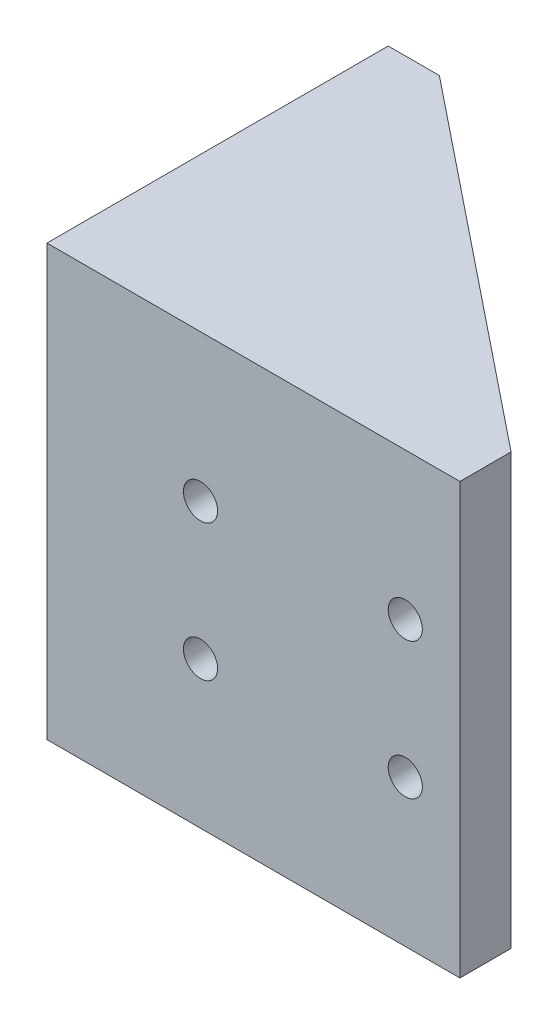
ISO-10303-21;
HEADER;
FILE_DESCRIPTION(('STEP AP214'),'2;1');
FILE_NAME('part.step','',(''),(''),'','','');
FILE_SCHEMA(('AUTOMOTIVE_DESIGN { 1 0 10303 214 1 1 1 1 }'));
ENDSEC;
DATA;
#1=APPLICATION_CONTEXT('core data for automotive mechanical design processes');
#2=APPLICATION_PROTOCOL_DEFINITION('international standard','automotive_design',2000,#1);
#3=PRODUCT_CONTEXT('',#1,'mechanical');
#4=PRODUCT('Part','Part','',(#3));
#5=PRODUCT_RELATED_PRODUCT_CATEGORY('part','',(#4));
#6=PRODUCT_DEFINITION_FORMATION('','',#4);
#7=PRODUCT_DEFINITION_CONTEXT('part definition',#1,'design');
#8=PRODUCT_DEFINITION('design','',#6,#7);
#9=PRODUCT_DEFINITION_SHAPE('','',#8);
#10=(LENGTH_UNIT() NAMED_UNIT(*) SI_UNIT(.MILLI.,.METRE.));
#11=(NAMED_UNIT(*) PLANE_ANGLE_UNIT() SI_UNIT($,.RADIAN.));
#12=(NAMED_UNIT(*) SI_UNIT($,.STERADIAN.) SOLID_ANGLE_UNIT());
#13=UNCERTAINTY_MEASURE_WITH_UNIT(LENGTH_MEASURE(1.E-05),#10,'distance_accuracy_value','');
#14=(GEOMETRIC_REPRESENTATION_CONTEXT(3) GLOBAL_UNCERTAINTY_ASSIGNED_CONTEXT((#13)) GLOBAL_UNIT_ASSIGNED_CONTEXT((#10,
#11,#12)) REPRESENTATION_CONTEXT('',''));
#15=CARTESIAN_POINT('',(0.,0.,0.));
#16=DIRECTION('',(0.,0.,1.));
#17=DIRECTION('',(1.,0.,0.));
#18=AXIS2_PLACEMENT_3D('',#15,#16,#17);
#19=CARTESIAN_POINT('',(24.2,12.6,-3.));
#20=DIRECTION('',(-0.625592184650773,0.,0.780150253799788));
#21=DIRECTION('',(0.780150253799788,0.,0.625592184650773));
#22=AXIS2_PLACEMENT_3D('',#19,#20,#21);
#23=PLANE('',#22);
#24=DIRECTION('',(0.780150253799788,0.,0.625592184650773));
#25=VECTOR('',#24,1.);
#26=CARTESIAN_POINT('',(24.2,-10.1,-3.));
#27=LINE('',#26,#25);
#28=CARTESIAN_POINT('',(3.,-10.1,-20.));
#29=VERTEX_POINT('',#28);
#30=CARTESIAN_POINT('',(24.2,-10.1,-3.));
#31=VERTEX_POINT('',#30);
#32=EDGE_CURVE('E144',#29,#31,#27,.T.);
#33=ORIENTED_EDGE('',*,*,#32,.T.);
#34=DIRECTION('',(0.,-1.,0.));
#35=VECTOR('',#34,1.);
#36=CARTESIAN_POINT('',(24.2,12.6,-3.));
#37=LINE('',#36,#35);
#38=CARTESIAN_POINT('',(24.2,-12.6,-3.));
#39=VERTEX_POINT('',#38);
#40=EDGE_CURVE('E130',#31,#39,#37,.T.);
#41=ORIENTED_EDGE('',*,*,#40,.T.);
#42=DIRECTION('',(-0.780150253799788,0.,-0.625592184650773));
#43=VECTOR('',#42,1.);
#44=CARTESIAN_POINT('',(24.2,-12.6,-3.));
#45=LINE('',#44,#43);
#46=CARTESIAN_POINT('',(3.,-12.6,-20.));
#47=VERTEX_POINT('',#46);
#48=EDGE_CURVE('E174',#39,#47,#45,.T.);
#49=ORIENTED_EDGE('',*,*,#48,.T.);
#50=DIRECTION('',(0.,-1.,0.));
#51=VECTOR('',#50,1.);
#52=CARTESIAN_POINT('',(3.,12.6,-20.));
#53=LINE('',#52,#51);
#54=EDGE_CURVE('E162',#29,#47,#53,.T.);
#55=ORIENTED_EDGE('',*,*,#54,.F.);
#56=EDGE_LOOP('',(#33,#41,#49,#55));
#57=FACE_BOUND('',#56,.T.);
#58=ADVANCED_FACE('F35',(#57),#23,.F.);
#59=CARTESIAN_POINT('',(0.,12.6,-20.));
#60=DIRECTION('',(1.,0.,0.));
#61=DIRECTION('',(0.,0.,-1.));
#62=AXIS2_PLACEMENT_3D('',#59,#60,#61);
#63=PLANE('',#62);
#64=CARTESIAN_POINT('',(0.,7.,-16.));
#65=DIRECTION('',(1.,0.,0.));
#66=DIRECTION('',(0.,1.,0.));
#67=AXIS2_PLACEMENT_3D('',#64,#65,#66);
#68=CIRCLE('',#67,1.6);
#69=CARTESIAN_POINT('',(0.,8.6,-16.));
#70=VERTEX_POINT('',#69);
#71=EDGE_CURVE('E208',#70,#70,#68,.T.);
#72=ORIENTED_EDGE('',*,*,#71,.T.);
#73=EDGE_LOOP('',(#72));
#74=FACE_BOUND('',#73,.T.);
#75=CARTESIAN_POINT('',(0.,-7.,-16.));
#76=DIRECTION('',(1.,0.,0.));
#77=DIRECTION('',(0.,-1.,0.));
#78=AXIS2_PLACEMENT_3D('',#75,#76,#77);
#79=CIRCLE('',#78,1.6);
#80=CARTESIAN_POINT('',(0.,-8.6,-16.));
#81=VERTEX_POINT('',#80);
#82=EDGE_CURVE('E215',#81,#81,#79,.T.);
#83=ORIENTED_EDGE('',*,*,#82,.T.);
#84=EDGE_LOOP('',(#83));
#85=FACE_BOUND('',#84,.T.);
#86=DIRECTION('',(0.,0.,1.));
#87=VECTOR('',#86,1.);
#88=CARTESIAN_POINT('',(0.,-12.6,-20.));
#89=LINE('',#88,#87);
#90=CARTESIAN_POINT('',(0.,-12.6,-20.));
#91=VERTEX_POINT('',#90);
#92=CARTESIAN_POINT('',(0.,-12.6,0.));
#93=VERTEX_POINT('',#92);
#94=EDGE_CURVE('E180',#91,#93,#89,.T.);
#95=ORIENTED_EDGE('',*,*,#94,.T.);
#96=DIRECTION('',(0.,-1.,0.));
#97=VECTOR('',#96,1.);
#98=CARTESIAN_POINT('',(0.,12.6,0.));
#99=LINE('',#98,#97);
#100=CARTESIAN_POINT('',(0.,12.6,0.));
#101=VERTEX_POINT('',#100);
#102=EDGE_CURVE('E145',#101,#93,#99,.T.);
#103=ORIENTED_EDGE('',*,*,#102,.F.);
#104=DIRECTION('',(0.,0.,1.));
#105=VECTOR('',#104,1.);
#106=CARTESIAN_POINT('',(0.,12.6,-20.));
#107=LINE('',#106,#105);
#108=CARTESIAN_POINT('',(0.,12.6,-20.));
#109=VERTEX_POINT('',#108);
#110=EDGE_CURVE('E173',#109,#101,#107,.T.);
#111=ORIENTED_EDGE('',*,*,#110,.F.);
#112=DIRECTION('',(0.,-1.,0.));
#113=VECTOR('',#112,1.);
#114=CARTESIAN_POINT('',(0.,12.6,-20.));
#115=LINE('',#114,#113);
#116=EDGE_CURVE('E166',#109,#91,#115,.T.);
#117=ORIENTED_EDGE('',*,*,#116,.T.);
#118=EDGE_LOOP('',(#95,#103,#111,#117));
#119=FACE_BOUND('',#118,.T.);
#120=ADVANCED_FACE('F270',(#74,#85,#119),#63,.F.);
#121=CARTESIAN_POINT('',(0.,12.6,0.));
#122=DIRECTION('',(0.,0.,-1.));
#123=DIRECTION('',(-1.,0.,0.));
#124=AXIS2_PLACEMENT_3D('',#121,#122,#123);
#125=PLANE('',#124);
#126=CARTESIAN_POINT('',(9.,-4.,0.));
#127=DIRECTION('',(0.,0.,1.));
#128=DIRECTION('',(-1.,0.,0.));
#129=AXIS2_PLACEMENT_3D('',#126,#127,#128);
#130=CIRCLE('',#129,1.);
#131=CARTESIAN_POINT('',(8.,-4.,0.));
#132=VERTEX_POINT('',#131);
#133=EDGE_CURVE('E204',#132,#132,#130,.T.);
#134=ORIENTED_EDGE('',*,*,#133,.F.);
#135=EDGE_LOOP('',(#134));
#136=FACE_BOUND('',#135,.T.);
#137=CARTESIAN_POINT('',(9.,4.,0.));
#138=DIRECTION('',(0.,0.,1.));
#139=DIRECTION('',(1.,0.,0.));
#140=AXIS2_PLACEMENT_3D('',#137,#138,#139);
#141=CIRCLE('',#140,1.);
#142=CARTESIAN_POINT('',(10.,4.,0.));
#143=VERTEX_POINT('',#142);
#144=EDGE_CURVE('E207',#143,#143,#141,.T.);
#145=ORIENTED_EDGE('',*,*,#144,.F.);
#146=EDGE_LOOP('',(#145));
#147=FACE_BOUND('',#146,.T.);
#148=CARTESIAN_POINT('',(21.,4.,0.));
#149=DIRECTION('',(0.,0.,1.));
#150=DIRECTION('',(-1.,0.,0.));
#151=AXIS2_PLACEMENT_3D('',#148,#149,#150);
#152=CIRCLE('',#151,1.);
#153=CARTESIAN_POINT('',(20.,4.,0.));
#154=VERTEX_POINT('',#153);
#155=EDGE_CURVE('E203',#154,#154,#152,.T.);
#156=ORIENTED_EDGE('',*,*,#155,.F.);
#157=EDGE_LOOP('',(#156));
#158=FACE_BOUND('',#157,.T.);
#159=CARTESIAN_POINT('',(21.,-4.,0.));
#160=DIRECTION('',(0.,0.,1.));
#161=DIRECTION('',(1.,0.,0.));
#162=AXIS2_PLACEMENT_3D('',#159,#160,#161);
#163=CIRCLE('',#162,1.);
#164=CARTESIAN_POINT('',(22.,-4.,0.));
#165=VERTEX_POINT('',#164);
#166=EDGE_CURVE('E199',#165,#165,#163,.T.);
#167=ORIENTED_EDGE('',*,*,#166,.F.);
#168=EDGE_LOOP('',(#167));
#169=FACE_BOUND('',#168,.T.);
#170=DIRECTION('',(1.,0.,0.));
#171=VECTOR('',#170,1.);
#172=CARTESIAN_POINT('',(0.,-12.6,0.));
#173=LINE('',#172,#171);
#174=CARTESIAN_POINT('',(24.2,-12.6,0.));
#175=VERTEX_POINT('',#174);
#176=EDGE_CURVE('E178',#93,#175,#173,.T.);
#177=ORIENTED_EDGE('',*,*,#176,.T.);
#178=DIRECTION('',(0.,-1.,0.));
#179=VECTOR('',#178,1.);
#180=CARTESIAN_POINT('',(24.2,12.6,0.));
#181=LINE('',#180,#179);
#182=CARTESIAN_POINT('',(24.2,12.6,0.));
#183=VERTEX_POINT('',#182);
#184=EDGE_CURVE('E155',#183,#175,#181,.T.);
#185=ORIENTED_EDGE('',*,*,#184,.F.);
#186=DIRECTION('',(1.,0.,0.));
#187=VECTOR('',#186,1.);
#188=CARTESIAN_POINT('',(0.,12.6,0.));
#189=LINE('',#188,#187);
#190=EDGE_CURVE('E188',#101,#183,#189,.T.);
#191=ORIENTED_EDGE('',*,*,#190,.F.);
#192=ORIENTED_EDGE('',*,*,#102,.T.);
#193=EDGE_LOOP('',(#177,#185,#191,#192));
#194=FACE_BOUND('',#193,.T.);
#195=ADVANCED_FACE('F275',(#136,#147,#158,#169,#194),#125,.F.);
#196=CARTESIAN_POINT('',(24.2,12.6,0.));
#197=DIRECTION('',(-1.,0.,0.));
#198=DIRECTION('',(0.,0.,1.));
#199=AXIS2_PLACEMENT_3D('',#196,#197,#198);
#200=PLANE('',#199);
#201=DIRECTION('',(0.,0.,-1.));
#202=VECTOR('',#201,1.);
#203=CARTESIAN_POINT('',(24.2,-12.6,0.));
#204=LINE('',#203,#202);
#205=EDGE_CURVE('E176',#175,#39,#204,.T.);
#206=ORIENTED_EDGE('',*,*,#205,.T.);
#207=ORIENTED_EDGE('',*,*,#40,.F.);
#208=CARTESIAN_POINT('',(24.2,10.1,-3.));
#209=VERTEX_POINT('',#208);
#210=EDGE_CURVE('E122',#209,#31,#37,.T.);
#211=ORIENTED_EDGE('',*,*,#210,.F.);
#212=CARTESIAN_POINT('',(24.2,12.6,-3.));
#213=VERTEX_POINT('',#212);
#214=EDGE_CURVE('E128',#213,#209,#37,.T.);
#215=ORIENTED_EDGE('',*,*,#214,.F.);
#216=DIRECTION('',(0.,0.,-1.));
#217=VECTOR('',#216,1.);
#218=CARTESIAN_POINT('',(24.2,12.6,0.));
#219=LINE('',#218,#217);
#220=EDGE_CURVE('E186',#183,#213,#219,.T.);
#221=ORIENTED_EDGE('',*,*,#220,.F.);
#222=ORIENTED_EDGE('',*,*,#184,.T.);
#223=EDGE_LOOP('',(#206,#207,#211,#215,#221,#222));
#224=FACE_BOUND('',#223,.T.);
#225=ADVANCED_FACE('F125',(#224),#200,.F.);
#226=ORIENTED_EDGE('',*,*,#214,.T.);
#227=DIRECTION('',(-0.780150253799788,0.,-0.625592184650773));
#228=VECTOR('',#227,1.);
#229=CARTESIAN_POINT('',(24.2,10.1,-3.));
#230=LINE('',#229,#228);
#231=CARTESIAN_POINT('',(3.,10.1,-20.));
#232=VERTEX_POINT('',#231);
#233=EDGE_CURVE('E135',#209,#232,#230,.T.);
#234=ORIENTED_EDGE('',*,*,#233,.T.);
#235=CARTESIAN_POINT('',(3.,12.6,-20.));
#236=VERTEX_POINT('',#235);
#237=EDGE_CURVE('E159',#236,#232,#53,.T.);
#238=ORIENTED_EDGE('',*,*,#237,.F.);
#239=DIRECTION('',(-0.780150253799788,0.,-0.625592184650773));
#240=VECTOR('',#239,1.);
#241=CARTESIAN_POINT('',(24.2,12.6,-3.));
#242=LINE('',#241,#240);
#243=EDGE_CURVE('E154',#213,#236,#242,.T.);
#244=ORIENTED_EDGE('',*,*,#243,.F.);
#245=EDGE_LOOP('',(#226,#234,#238,#244));
#246=FACE_BOUND('',#245,.T.);
#247=ADVANCED_FACE('F153',(#246),#23,.F.);
#248=CARTESIAN_POINT('',(3.,12.6,-20.));
#249=DIRECTION('',(0.,0.,1.));
#250=DIRECTION('',(1.,0.,0.));
#251=AXIS2_PLACEMENT_3D('',#248,#249,#250);
#252=PLANE('',#251);
#253=DIRECTION('',(-1.,0.,0.));
#254=VECTOR('',#253,1.);
#255=CARTESIAN_POINT('',(3.,-12.6,-20.));
#256=LINE('',#255,#254);
#257=EDGE_CURVE('E171',#47,#91,#256,.T.);
#258=ORIENTED_EDGE('',*,*,#257,.T.);
#259=ORIENTED_EDGE('',*,*,#116,.F.);
#260=DIRECTION('',(-1.,0.,0.));
#261=VECTOR('',#260,1.);
#262=CARTESIAN_POINT('',(3.,12.6,-20.));
#263=LINE('',#262,#261);
#264=EDGE_CURVE('E170',#236,#109,#263,.T.);
#265=ORIENTED_EDGE('',*,*,#264,.F.);
#266=ORIENTED_EDGE('',*,*,#237,.T.);
#267=DIRECTION('',(0.,1.,0.));
#268=VECTOR('',#267,1.);
#269=CARTESIAN_POINT('',(3.,-10.1,-20.));
#270=LINE('',#269,#268);
#271=EDGE_CURVE('E195',#29,#232,#270,.T.);
#272=ORIENTED_EDGE('',*,*,#271,.F.);
#273=ORIENTED_EDGE('',*,*,#54,.T.);
#274=EDGE_LOOP('',(#258,#259,#265,#266,#272,#273));
#275=FACE_BOUND('',#274,.T.);
#276=ADVANCED_FACE('F281',(#275),#252,.F.);
#277=CARTESIAN_POINT('',(0.,12.6,0.));
#278=DIRECTION('',(0.,1.,0.));
#279=DIRECTION('',(0.,0.,1.));
#280=AXIS2_PLACEMENT_3D('',#277,#278,#279);
#281=PLANE('',#280);
#282=ORIENTED_EDGE('',*,*,#110,.T.);
#283=ORIENTED_EDGE('',*,*,#190,.T.);
#284=ORIENTED_EDGE('',*,*,#220,.T.);
#285=ORIENTED_EDGE('',*,*,#243,.T.);
#286=ORIENTED_EDGE('',*,*,#264,.T.);
#287=EDGE_LOOP('',(#282,#283,#284,#285,#286));
#288=FACE_BOUND('',#287,.T.);
#289=ADVANCED_FACE('F286',(#288),#281,.T.);
#290=CARTESIAN_POINT('',(0.,-12.6,0.));
#291=DIRECTION('',(0.,1.,0.));
#292=DIRECTION('',(0.,0.,1.));
#293=AXIS2_PLACEMENT_3D('',#290,#291,#292);
#294=PLANE('',#293);
#295=ORIENTED_EDGE('',*,*,#94,.F.);
#296=ORIENTED_EDGE('',*,*,#257,.F.);
#297=ORIENTED_EDGE('',*,*,#48,.F.);
#298=ORIENTED_EDGE('',*,*,#205,.F.);
#299=ORIENTED_EDGE('',*,*,#176,.F.);
#300=EDGE_LOOP('',(#295,#296,#297,#298,#299));
#301=FACE_BOUND('',#300,.T.);
#302=ADVANCED_FACE('F328',(#301),#294,.F.);
#303=CARTESIAN_POINT('',(3.,-10.1,-3.));
#304=DIRECTION('',(0.,-1.,0.));
#305=DIRECTION('',(1.,0.,0.));
#306=AXIS2_PLACEMENT_3D('',#303,#304,#305);
#307=PLANE('',#306);
#308=DIRECTION('',(-1.,0.,0.));
#309=VECTOR('',#308,1.);
#310=CARTESIAN_POINT('',(3.,-10.1,-8.));
#311=LINE('',#310,#309);
#312=CARTESIAN_POINT('',(3.,-10.1,-8.));
#313=VERTEX_POINT('',#312);
#314=CARTESIAN_POINT('',(8.,-10.1,-8.));
#315=VERTEX_POINT('',#314);
#316=EDGE_CURVE('E244',#313,#315,#311,.F.);
#317=ORIENTED_EDGE('',*,*,#316,.T.);
#318=DIRECTION('',(0.,0.,-1.));
#319=VECTOR('',#318,1.);
#320=CARTESIAN_POINT('',(8.,-10.1,26.282759432813));
#321=LINE('',#320,#319);
#322=CARTESIAN_POINT('',(8.,-10.1,-3.));
#323=VERTEX_POINT('',#322);
#324=EDGE_CURVE('E225',#323,#315,#321,.T.);
#325=ORIENTED_EDGE('',*,*,#324,.F.);
#326=DIRECTION('',(1.,0.,0.));
#327=VECTOR('',#326,1.);
#328=CARTESIAN_POINT('',(24.2,-10.1,-3.));
#329=LINE('',#328,#327);
#330=EDGE_CURVE('E227',#323,#31,#329,.T.);
#331=ORIENTED_EDGE('',*,*,#330,.T.);
#332=ORIENTED_EDGE('',*,*,#32,.F.);
#333=DIRECTION('',(0.,0.,-1.));
#334=VECTOR('',#333,1.);
#335=CARTESIAN_POINT('',(3.,-10.1,-3.));
#336=LINE('',#335,#334);
#337=EDGE_CURVE('E183',#313,#29,#336,.T.);
#338=ORIENTED_EDGE('',*,*,#337,.F.);
#339=EDGE_LOOP('',(#317,#325,#331,#332,#338));
#340=FACE_BOUND('',#339,.T.);
#341=ADVANCED_FACE('F236',(#340),#307,.F.);
#342=CARTESIAN_POINT('',(3.,10.1,-3.));
#343=DIRECTION('',(0.,1.,0.));
#344=DIRECTION('',(-1.,0.,0.));
#345=AXIS2_PLACEMENT_3D('',#342,#343,#344);
#346=PLANE('',#345);
#347=ORIENTED_EDGE('',*,*,#233,.F.);
#348=DIRECTION('',(-1.,0.,0.));
#349=VECTOR('',#348,1.);
#350=CARTESIAN_POINT('',(8.,10.1,-3.));
#351=LINE('',#350,#349);
#352=CARTESIAN_POINT('',(8.,10.1,-3.));
#353=VERTEX_POINT('',#352);
#354=EDGE_CURVE('E137',#209,#353,#351,.T.);
#355=ORIENTED_EDGE('',*,*,#354,.T.);
#356=DIRECTION('',(0.,0.,-1.));
#357=VECTOR('',#356,1.);
#358=CARTESIAN_POINT('',(8.,10.1,26.282759432813));
#359=LINE('',#358,#357);
#360=CARTESIAN_POINT('',(8.,10.1,-8.));
#361=VERTEX_POINT('',#360);
#362=EDGE_CURVE('E223',#353,#361,#359,.T.);
#363=ORIENTED_EDGE('',*,*,#362,.T.);
#364=DIRECTION('',(1.,0.,0.));
#365=VECTOR('',#364,1.);
#366=CARTESIAN_POINT('',(3.,10.1,-8.));
#367=LINE('',#366,#365);
#368=CARTESIAN_POINT('',(3.,10.1,-8.));
#369=VERTEX_POINT('',#368);
#370=EDGE_CURVE('E58',#361,#369,#367,.F.);
#371=ORIENTED_EDGE('',*,*,#370,.T.);
#372=DIRECTION('',(0.,0.,-1.));
#373=VECTOR('',#372,1.);
#374=CARTESIAN_POINT('',(3.,10.1,-3.));
#375=LINE('',#374,#373);
#376=EDGE_CURVE('E139',#369,#232,#375,.T.);
#377=ORIENTED_EDGE('',*,*,#376,.T.);
#378=EDGE_LOOP('',(#347,#355,#363,#371,#377));
#379=FACE_BOUND('',#378,.T.);
#380=ADVANCED_FACE('F136',(#379),#346,.F.);
#381=CARTESIAN_POINT('',(3.,-10.1,-3.));
#382=DIRECTION('',(-1.,0.,0.));
#383=DIRECTION('',(0.,0.,1.));
#384=AXIS2_PLACEMENT_3D('',#381,#382,#383);
#385=PLANE('',#384);
#386=CARTESIAN_POINT('',(3.,7.,-16.));
#387=DIRECTION('',(1.,0.,0.));
#388=DIRECTION('',(0.,1.,0.));
#389=AXIS2_PLACEMENT_3D('',#386,#387,#388);
#390=CIRCLE('',#389,1.6);
#391=CARTESIAN_POINT('',(3.,8.6,-16.));
#392=VERTEX_POINT('',#391);
#393=EDGE_CURVE('E218',#392,#392,#390,.T.);
#394=ORIENTED_EDGE('',*,*,#393,.F.);
#395=EDGE_LOOP('',(#394));
#396=FACE_BOUND('',#395,.T.);
#397=CARTESIAN_POINT('',(3.,5.1,-8.));
#398=DIRECTION('',(-1.,0.,0.));
#399=DIRECTION('',(0.,0.,1.));
#400=AXIS2_PLACEMENT_3D('',#397,#398,#399);
#401=CIRCLE('',#400,5.);
#402=CARTESIAN_POINT('',(3.,5.1,-3.));
#403=VERTEX_POINT('',#402);
#404=EDGE_CURVE('E245',#369,#403,#401,.F.);
#405=ORIENTED_EDGE('',*,*,#404,.T.);
#406=DIRECTION('',(0.,1.,0.));
#407=VECTOR('',#406,1.);
#408=CARTESIAN_POINT('',(3.,-10.1,-3.));
#409=LINE('',#408,#407);
#410=CARTESIAN_POINT('',(3.,-5.1,-3.));
#411=VERTEX_POINT('',#410);
#412=EDGE_CURVE('E193',#411,#403,#409,.T.);
#413=ORIENTED_EDGE('',*,*,#412,.F.);
#414=CARTESIAN_POINT('',(3.,-5.1,-8.));
#415=DIRECTION('',(-1.,0.,0.));
#416=DIRECTION('',(0.,0.,1.));
#417=AXIS2_PLACEMENT_3D('',#414,#415,#416);
#418=CIRCLE('',#417,5.);
#419=EDGE_CURVE('E50',#411,#313,#418,.F.);
#420=ORIENTED_EDGE('',*,*,#419,.T.);
#421=ORIENTED_EDGE('',*,*,#337,.T.);
#422=ORIENTED_EDGE('',*,*,#271,.T.);
#423=ORIENTED_EDGE('',*,*,#376,.F.);
#424=EDGE_LOOP('',(#405,#413,#420,#421,#422,#423));
#425=FACE_BOUND('',#424,.T.);
#426=CARTESIAN_POINT('',(3.,-7.,-16.));
#427=DIRECTION('',(1.,0.,0.));
#428=DIRECTION('',(0.,-1.,0.));
#429=AXIS2_PLACEMENT_3D('',#426,#427,#428);
#430=CIRCLE('',#429,1.6);
#431=CARTESIAN_POINT('',(3.,-8.6,-16.));
#432=VERTEX_POINT('',#431);
#433=EDGE_CURVE('E151',#432,#432,#430,.T.);
#434=ORIENTED_EDGE('',*,*,#433,.F.);
#435=EDGE_LOOP('',(#434));
#436=FACE_BOUND('',#435,.T.);
#437=ADVANCED_FACE('F248',(#396,#425,#436),#385,.F.);
#438=CARTESIAN_POINT('',(0.,0.,-3.));
#439=DIRECTION('',(0.,0.,-1.));
#440=DIRECTION('',(-1.,0.,0.));
#441=AXIS2_PLACEMENT_3D('',#438,#439,#440);
#442=PLANE('',#441);
#443=CARTESIAN_POINT('',(9.,-4.,-3.));
#444=DIRECTION('',(0.,0.,-1.));
#445=DIRECTION('',(-1.,0.,0.));
#446=AXIS2_PLACEMENT_3D('',#443,#444,#445);
#447=CIRCLE('',#446,1.);
#448=CARTESIAN_POINT('',(8.,-4.,-3.));
#449=VERTEX_POINT('',#448);
#450=EDGE_CURVE('E197',#449,#449,#447,.T.);
#451=ORIENTED_EDGE('',*,*,#450,.F.);
#452=EDGE_LOOP('',(#451));
#453=FACE_BOUND('',#452,.T.);
#454=CARTESIAN_POINT('',(9.,4.,-3.));
#455=DIRECTION('',(0.,0.,-1.));
#456=DIRECTION('',(-1.,0.,0.));
#457=AXIS2_PLACEMENT_3D('',#454,#455,#456);
#458=CIRCLE('',#457,1.);
#459=CARTESIAN_POINT('',(8.,4.,-3.));
#460=VERTEX_POINT('',#459);
#461=EDGE_CURVE('E358',#460,#460,#458,.T.);
#462=ORIENTED_EDGE('',*,*,#461,.F.);
#463=EDGE_LOOP('',(#462));
#464=FACE_BOUND('',#463,.T.);
#465=CARTESIAN_POINT('',(21.,4.,-3.));
#466=DIRECTION('',(0.,0.,-1.));
#467=DIRECTION('',(-1.,0.,0.));
#468=AXIS2_PLACEMENT_3D('',#465,#466,#467);
#469=CIRCLE('',#468,1.);
#470=CARTESIAN_POINT('',(20.,4.,-3.));
#471=VERTEX_POINT('',#470);
#472=EDGE_CURVE('E356',#471,#471,#469,.T.);
#473=ORIENTED_EDGE('',*,*,#472,.F.);
#474=EDGE_LOOP('',(#473));
#475=FACE_BOUND('',#474,.T.);
#476=CARTESIAN_POINT('',(21.,-4.,-3.));
#477=DIRECTION('',(0.,0.,-1.));
#478=DIRECTION('',(-1.,0.,0.));
#479=AXIS2_PLACEMENT_3D('',#476,#477,#478);
#480=CIRCLE('',#479,1.);
#481=CARTESIAN_POINT('',(20.,-4.,-3.));
#482=VERTEX_POINT('',#481);
#483=EDGE_CURVE('E202',#482,#482,#480,.T.);
#484=ORIENTED_EDGE('',*,*,#483,.F.);
#485=EDGE_LOOP('',(#484));
#486=FACE_BOUND('',#485,.T.);
#487=ORIENTED_EDGE('',*,*,#354,.F.);
#488=ORIENTED_EDGE('',*,*,#210,.T.);
#489=ORIENTED_EDGE('',*,*,#330,.F.);
#490=CARTESIAN_POINT('',(8.,-5.1,-3.));
#491=DIRECTION('',(0.,0.,-1.));
#492=DIRECTION('',(-1.,0.,0.));
#493=AXIS2_PLACEMENT_3D('',#490,#491,#492);
#494=CIRCLE('',#493,5.);
#495=EDGE_CURVE('E229',#411,#323,#494,.F.);
#496=ORIENTED_EDGE('',*,*,#495,.F.);
#497=ORIENTED_EDGE('',*,*,#412,.T.);
#498=CARTESIAN_POINT('',(8.,5.1,-3.));
#499=DIRECTION('',(0.,0.,-1.));
#500=DIRECTION('',(-1.,0.,0.));
#501=AXIS2_PLACEMENT_3D('',#498,#499,#500);
#502=CIRCLE('',#501,5.);
#503=EDGE_CURVE('E149',#353,#403,#502,.F.);
#504=ORIENTED_EDGE('',*,*,#503,.F.);
#505=EDGE_LOOP('',(#487,#488,#489,#496,#497,#504));
#506=FACE_BOUND('',#505,.T.);
#507=ADVANCED_FACE('F147',(#453,#464,#475,#486,#506),#442,.T.);
#508=CARTESIAN_POINT('',(21.,-4.,-20.));
#509=DIRECTION('',(0.,0.,1.));
#510=DIRECTION('',(1.,0.,0.));
#511=AXIS2_PLACEMENT_3D('',#508,#509,#510);
#512=CYLINDRICAL_SURFACE('',#511,1.);
#513=ORIENTED_EDGE('',*,*,#483,.T.);
#514=EDGE_LOOP('',(#513));
#515=FACE_BOUND('',#514,.T.);
#516=ORIENTED_EDGE('',*,*,#166,.T.);
#517=EDGE_LOOP('',(#516));
#518=FACE_BOUND('',#517,.T.);
#519=ADVANCED_FACE('F312',(#515,#518),#512,.F.);
#520=CARTESIAN_POINT('',(21.,4.,-20.));
#521=DIRECTION('',(0.,0.,1.));
#522=DIRECTION('',(1.,0.,0.));
#523=AXIS2_PLACEMENT_3D('',#520,#521,#522);
#524=CYLINDRICAL_SURFACE('',#523,1.);
#525=ORIENTED_EDGE('',*,*,#472,.T.);
#526=EDGE_LOOP('',(#525));
#527=FACE_BOUND('',#526,.T.);
#528=ORIENTED_EDGE('',*,*,#155,.T.);
#529=EDGE_LOOP('',(#528));
#530=FACE_BOUND('',#529,.T.);
#531=ADVANCED_FACE('F308',(#527,#530),#524,.F.);
#532=CARTESIAN_POINT('',(9.,4.,-20.));
#533=DIRECTION('',(0.,0.,1.));
#534=DIRECTION('',(1.,0.,0.));
#535=AXIS2_PLACEMENT_3D('',#532,#533,#534);
#536=CYLINDRICAL_SURFACE('',#535,1.);
#537=ORIENTED_EDGE('',*,*,#461,.T.);
#538=EDGE_LOOP('',(#537));
#539=FACE_BOUND('',#538,.T.);
#540=ORIENTED_EDGE('',*,*,#144,.T.);
#541=EDGE_LOOP('',(#540));
#542=FACE_BOUND('',#541,.T.);
#543=ADVANCED_FACE('F311',(#539,#542),#536,.F.);
#544=CARTESIAN_POINT('',(9.,-4.,-20.));
#545=DIRECTION('',(0.,0.,1.));
#546=DIRECTION('',(1.,0.,0.));
#547=AXIS2_PLACEMENT_3D('',#544,#545,#546);
#548=CYLINDRICAL_SURFACE('',#547,1.);
#549=ORIENTED_EDGE('',*,*,#450,.T.);
#550=EDGE_LOOP('',(#549));
#551=FACE_BOUND('',#550,.T.);
#552=ORIENTED_EDGE('',*,*,#133,.T.);
#553=EDGE_LOOP('',(#552));
#554=FACE_BOUND('',#553,.T.);
#555=ADVANCED_FACE('F302',(#551,#554),#548,.F.);
#556=CARTESIAN_POINT('',(0.,-7.,-16.));
#557=DIRECTION('',(1.,0.,0.));
#558=DIRECTION('',(0.,1.,0.));
#559=AXIS2_PLACEMENT_3D('',#556,#557,#558);
#560=CYLINDRICAL_SURFACE('',#559,1.6);
#561=ORIENTED_EDGE('',*,*,#82,.F.);
#562=EDGE_LOOP('',(#561));
#563=FACE_BOUND('',#562,.T.);
#564=ORIENTED_EDGE('',*,*,#433,.T.);
#565=EDGE_LOOP('',(#564));
#566=FACE_BOUND('',#565,.T.);
#567=ADVANCED_FACE('F297',(#563,#566),#560,.F.);
#568=CARTESIAN_POINT('',(0.,7.,-16.));
#569=DIRECTION('',(1.,0.,0.));
#570=DIRECTION('',(0.,1.,0.));
#571=AXIS2_PLACEMENT_3D('',#568,#569,#570);
#572=CYLINDRICAL_SURFACE('',#571,1.6);
#573=ORIENTED_EDGE('',*,*,#71,.F.);
#574=EDGE_LOOP('',(#573));
#575=FACE_BOUND('',#574,.T.);
#576=ORIENTED_EDGE('',*,*,#393,.T.);
#577=EDGE_LOOP('',(#576));
#578=FACE_BOUND('',#577,.T.);
#579=ADVANCED_FACE('F293',(#575,#578),#572,.F.);
#580=CARTESIAN_POINT('',(0.,-5.1,-8.));
#581=DIRECTION('',(-1.,0.,0.));
#582=DIRECTION('',(0.,-1.,0.));
#583=AXIS2_PLACEMENT_3D('',#580,#581,#582);
#584=CYLINDRICAL_SURFACE('',#583,5.);
#585=ORIENTED_EDGE('',*,*,#419,.F.);
#586=CARTESIAN_POINT('',(8.,-5.1,-8.));
#587=DIRECTION('',(-0.707106781186547,0.,-0.707106781186547));
#588=DIRECTION('',(-0.707106781186547,0.,0.707106781186547));
#589=AXIS2_PLACEMENT_3D('',#586,#587,#588);
#590=ELLIPSE('',#589,7.07106781186547,5.);
#591=EDGE_CURVE('E11',#411,#315,#590,.F.);
#592=ORIENTED_EDGE('',*,*,#591,.T.);
#593=ORIENTED_EDGE('',*,*,#316,.F.);
#594=EDGE_LOOP('',(#585,#592,#593));
#595=FACE_BOUND('',#594,.T.);
#596=ADVANCED_FACE('F243',(#595),#584,.F.);
#597=CARTESIAN_POINT('',(0.,5.1,-8.));
#598=DIRECTION('',(1.,0.,0.));
#599=DIRECTION('',(0.,1.,0.));
#600=AXIS2_PLACEMENT_3D('',#597,#598,#599);
#601=CYLINDRICAL_SURFACE('',#600,5.);
#602=ORIENTED_EDGE('',*,*,#370,.F.);
#603=CARTESIAN_POINT('',(8.,5.1,-8.));
#604=DIRECTION('',(0.707106781186547,0.,0.707106781186547));
#605=DIRECTION('',(0.707106781186547,0.,-0.707106781186547));
#606=AXIS2_PLACEMENT_3D('',#603,#604,#605);
#607=ELLIPSE('',#606,7.07106781186547,5.);
#608=EDGE_CURVE('E43',#361,#403,#607,.T.);
#609=ORIENTED_EDGE('',*,*,#608,.T.);
#610=ORIENTED_EDGE('',*,*,#404,.F.);
#611=EDGE_LOOP('',(#602,#609,#610));
#612=FACE_BOUND('',#611,.T.);
#613=ADVANCED_FACE('F37',(#612),#601,.F.);
#614=CARTESIAN_POINT('',(8.,5.1,26.282759432813));
#615=DIRECTION('',(0.,0.,-1.));
#616=DIRECTION('',(-1.,0.,0.));
#617=AXIS2_PLACEMENT_3D('',#614,#615,#616);
#618=CYLINDRICAL_SURFACE('',#617,5.);
#619=ORIENTED_EDGE('',*,*,#362,.F.);
#620=ORIENTED_EDGE('',*,*,#503,.T.);
#621=ORIENTED_EDGE('',*,*,#608,.F.);
#622=EDGE_LOOP('',(#619,#620,#621));
#623=FACE_BOUND('',#622,.T.);
#624=ADVANCED_FACE('F260',(#623),#618,.F.);
#625=CARTESIAN_POINT('',(8.,-5.1,26.282759432813));
#626=DIRECTION('',(0.,0.,-1.));
#627=DIRECTION('',(-1.,0.,0.));
#628=AXIS2_PLACEMENT_3D('',#625,#626,#627);
#629=CYLINDRICAL_SURFACE('',#628,5.);
#630=ORIENTED_EDGE('',*,*,#495,.T.);
#631=ORIENTED_EDGE('',*,*,#324,.T.);
#632=ORIENTED_EDGE('',*,*,#591,.F.);
#633=EDGE_LOOP('',(#630,#631,#632));
#634=FACE_BOUND('',#633,.T.);
#635=ADVANCED_FACE('F240',(#634),#629,.F.);
#636=CLOSED_SHELL('',(#58,#120,#195,#225,#247,#276,#289,#302,#341,#380,#437,#507,#519,#531,#543,
#555,#567,#579,#596,#613,#624,#635));
#637=MANIFOLD_SOLID_BREP('B2',#636);
#638=ADVANCED_BREP_SHAPE_REPRESENTATION('',(#18,#637),#14);
#639=SHAPE_DEFINITION_REPRESENTATION(#9,#638);
ENDSEC;
END-ISO-10303-21;
